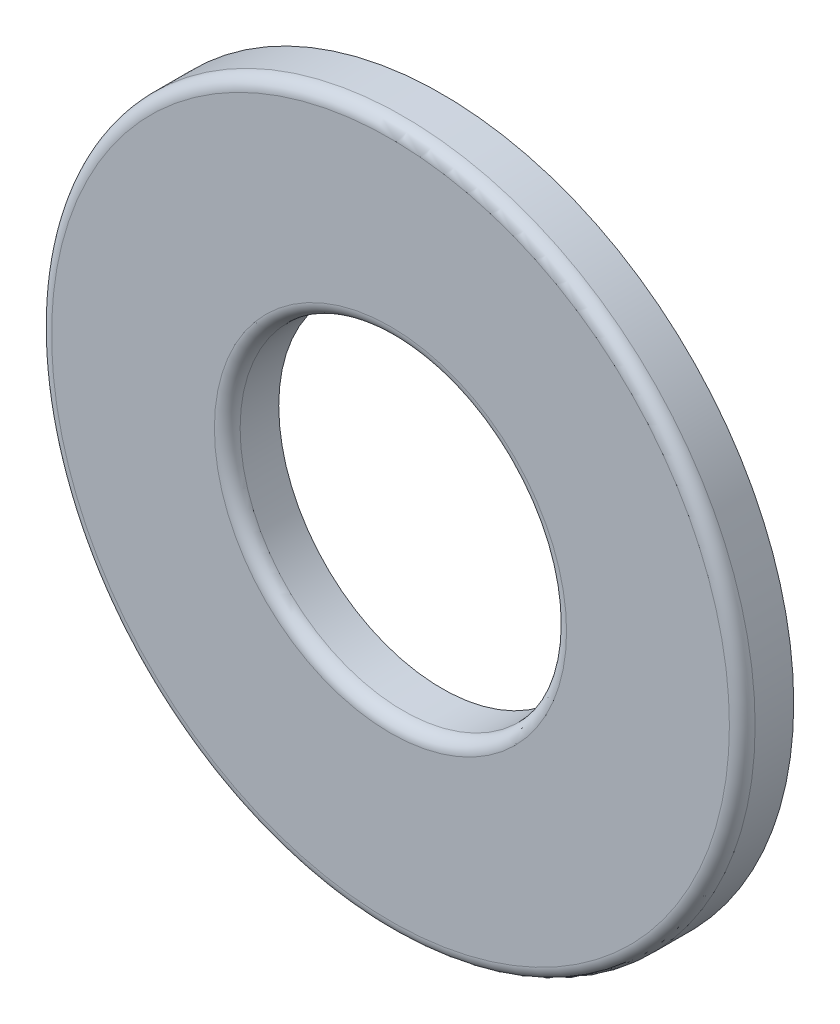
ISO-10303-21;
HEADER;
FILE_DESCRIPTION(('STEP AP214'),'2;1');
FILE_NAME('part.step','',(''),(''),'','','');
FILE_SCHEMA(('AUTOMOTIVE_DESIGN { 1 0 10303 214 1 1 1 1 }'));
ENDSEC;
DATA;
#1=APPLICATION_CONTEXT('core data for automotive mechanical design processes');
#2=APPLICATION_PROTOCOL_DEFINITION('international standard','automotive_design',2000,#1);
#3=PRODUCT_CONTEXT('',#1,'mechanical');
#4=PRODUCT('Part','Part','',(#3));
#5=PRODUCT_RELATED_PRODUCT_CATEGORY('part','',(#4));
#6=PRODUCT_DEFINITION_FORMATION('','',#4);
#7=PRODUCT_DEFINITION_CONTEXT('part definition',#1,'design');
#8=PRODUCT_DEFINITION('design','',#6,#7);
#9=PRODUCT_DEFINITION_SHAPE('','',#8);
#10=(LENGTH_UNIT() NAMED_UNIT(*) SI_UNIT(.MILLI.,.METRE.));
#11=(NAMED_UNIT(*) PLANE_ANGLE_UNIT() SI_UNIT($,.RADIAN.));
#12=(NAMED_UNIT(*) SI_UNIT($,.STERADIAN.) SOLID_ANGLE_UNIT());
#13=UNCERTAINTY_MEASURE_WITH_UNIT(LENGTH_MEASURE(1.E-05),#10,'distance_accuracy_value','');
#14=(GEOMETRIC_REPRESENTATION_CONTEXT(3) GLOBAL_UNCERTAINTY_ASSIGNED_CONTEXT((#13)) GLOBAL_UNIT_ASSIGNED_CONTEXT((#10,
#11,#12)) REPRESENTATION_CONTEXT('',''));
#15=CARTESIAN_POINT('',(0.,0.,0.));
#16=DIRECTION('',(0.,0.,1.));
#17=DIRECTION('',(1.,0.,0.));
#18=AXIS2_PLACEMENT_3D('',#15,#16,#17);
#19=CARTESIAN_POINT('',(0.,0.,0.406399999999997));
#20=DIRECTION('',(0.,0.,1.));
#21=DIRECTION('',(1.,0.,0.));
#22=AXIS2_PLACEMENT_3D('',#19,#20,#21);
#23=PLANE('',#22);
#24=CARTESIAN_POINT('',(0.,0.,0.406399999999997));
#25=DIRECTION('',(0.,0.,1.));
#26=DIRECTION('',(1.,0.,0.));
#27=AXIS2_PLACEMENT_3D('',#24,#25,#26);
#28=CIRCLE('',#27,5.35305);
#29=CARTESIAN_POINT('',(5.35305,0.,0.406399999999997));
#30=VERTEX_POINT('',#29);
#31=EDGE_CURVE('E57',#30,#30,#28,.T.);
#32=ORIENTED_EDGE('',*,*,#31,.T.);
#33=EDGE_LOOP('',(#32));
#34=FACE_BOUND('',#33,.T.);
#35=CARTESIAN_POINT('',(0.,0.,0.406399999999997));
#36=DIRECTION('',(0.,0.,1.));
#37=DIRECTION('',(1.,0.,0.));
#38=AXIS2_PLACEMENT_3D('',#35,#36,#37);
#39=CIRCLE('',#38,2.7813);
#40=CARTESIAN_POINT('',(2.7813,0.,0.406399999999997));
#41=VERTEX_POINT('',#40);
#42=EDGE_CURVE('E63',#41,#41,#39,.F.);
#43=ORIENTED_EDGE('',*,*,#42,.T.);
#44=EDGE_LOOP('',(#43));
#45=FACE_BOUND('',#44,.T.);
#46=ADVANCED_FACE('F43',(#34,#45),#23,.T.);
#47=CARTESIAN_POINT('',(0.,0.,0.406399999999997));
#48=DIRECTION('',(0.,0.,-1.));
#49=DIRECTION('',(-1.,0.,0.));
#50=AXIS2_PLACEMENT_3D('',#47,#48,#49);
#51=CYLINDRICAL_SURFACE('',#50,5.55625);
#52=CARTESIAN_POINT('',(0.,0.,0.203199999999997));
#53=DIRECTION('',(0.,0.,1.));
#54=DIRECTION('',(1.,0.,0.));
#55=AXIS2_PLACEMENT_3D('',#52,#53,#54);
#56=CIRCLE('',#55,5.55625);
#57=CARTESIAN_POINT('',(5.55625,0.,0.203199999999997));
#58=VERTEX_POINT('',#57);
#59=EDGE_CURVE('E51',#58,#58,#56,.F.);
#60=ORIENTED_EDGE('',*,*,#59,.T.);
#61=EDGE_LOOP('',(#60));
#62=FACE_BOUND('',#61,.T.);
#63=CARTESIAN_POINT('',(0.,0.,-0.406400000000003));
#64=DIRECTION('',(0.,0.,1.));
#65=DIRECTION('',(1.,0.,0.));
#66=AXIS2_PLACEMENT_3D('',#63,#64,#65);
#67=CIRCLE('',#66,5.55625);
#68=CARTESIAN_POINT('',(5.55625,0.,-0.406400000000003));
#69=VERTEX_POINT('',#68);
#70=EDGE_CURVE('E69',#69,#69,#67,.T.);
#71=ORIENTED_EDGE('',*,*,#70,.T.);
#72=EDGE_LOOP('',(#71));
#73=FACE_BOUND('',#72,.T.);
#74=ADVANCED_FACE('F84',(#62,#73),#51,.T.);
#75=CARTESIAN_POINT('',(0.,0.,0.406399999999997));
#76=DIRECTION('',(0.,0.,-1.));
#77=DIRECTION('',(-1.,0.,0.));
#78=AXIS2_PLACEMENT_3D('',#75,#76,#77);
#79=CYLINDRICAL_SURFACE('',#78,2.5781);
#80=CARTESIAN_POINT('',(0.,0.,0.203199999999997));
#81=DIRECTION('',(0.,0.,1.));
#82=DIRECTION('',(1.,0.,0.));
#83=AXIS2_PLACEMENT_3D('',#80,#81,#82);
#84=CIRCLE('',#83,2.5781);
#85=CARTESIAN_POINT('',(2.5781,0.,0.203199999999997));
#86=VERTEX_POINT('',#85);
#87=EDGE_CURVE('E10',#86,#86,#84,.T.);
#88=ORIENTED_EDGE('',*,*,#87,.T.);
#89=EDGE_LOOP('',(#88));
#90=FACE_BOUND('',#89,.T.);
#91=CARTESIAN_POINT('',(0.,0.,-0.406400000000003));
#92=DIRECTION('',(0.,0.,1.));
#93=DIRECTION('',(1.,0.,0.));
#94=AXIS2_PLACEMENT_3D('',#91,#92,#93);
#95=CIRCLE('',#94,2.5781);
#96=CARTESIAN_POINT('',(2.5781,0.,-0.406400000000003));
#97=VERTEX_POINT('',#96);
#98=EDGE_CURVE('E73',#97,#97,#95,.T.);
#99=ORIENTED_EDGE('',*,*,#98,.F.);
#100=EDGE_LOOP('',(#99));
#101=FACE_BOUND('',#100,.T.);
#102=ADVANCED_FACE('F82',(#90,#101),#79,.F.);
#103=CARTESIAN_POINT('',(0.,0.,-0.406400000000003));
#104=DIRECTION('',(0.,0.,1.));
#105=DIRECTION('',(1.,0.,0.));
#106=AXIS2_PLACEMENT_3D('',#103,#104,#105);
#107=PLANE('',#106);
#108=ORIENTED_EDGE('',*,*,#98,.T.);
#109=EDGE_LOOP('',(#108));
#110=FACE_BOUND('',#109,.T.);
#111=ORIENTED_EDGE('',*,*,#70,.F.);
#112=EDGE_LOOP('',(#111));
#113=FACE_BOUND('',#112,.T.);
#114=ADVANCED_FACE('F79',(#110,#113),#107,.F.);
#115=CARTESIAN_POINT('',(0.,0.,0.203199999999997));
#116=DIRECTION('',(0.,0.,1.));
#117=DIRECTION('',(1.,0.,0.));
#118=AXIS2_PLACEMENT_3D('',#115,#116,#117);
#119=TOROIDAL_SURFACE('',#118,5.35305,0.2032);
#120=ORIENTED_EDGE('',*,*,#59,.F.);
#121=EDGE_LOOP('',(#120));
#122=FACE_BOUND('',#121,.T.);
#123=ORIENTED_EDGE('',*,*,#31,.F.);
#124=EDGE_LOOP('',(#123));
#125=FACE_BOUND('',#124,.T.);
#126=ADVANCED_FACE('F91',(#122,#125),#119,.T.);
#127=CARTESIAN_POINT('',(0.,0.,0.203199999999997));
#128=DIRECTION('',(0.,0.,1.));
#129=DIRECTION('',(1.,0.,0.));
#130=AXIS2_PLACEMENT_3D('',#127,#128,#129);
#131=TOROIDAL_SURFACE('',#130,2.7813,0.2032);
#132=ORIENTED_EDGE('',*,*,#42,.F.);
#133=EDGE_LOOP('',(#132));
#134=FACE_BOUND('',#133,.T.);
#135=ORIENTED_EDGE('',*,*,#87,.F.);
#136=EDGE_LOOP('',(#135));
#137=FACE_BOUND('',#136,.T.);
#138=ADVANCED_FACE('F45',(#134,#137),#131,.T.);
#139=CLOSED_SHELL('',(#46,#74,#102,#114,#126,#138));
#140=MANIFOLD_SOLID_BREP('B2',#139);
#141=ADVANCED_BREP_SHAPE_REPRESENTATION('',(#18,#140),#14);
#142=SHAPE_DEFINITION_REPRESENTATION(#9,#141);
ENDSEC;
END-ISO-10303-21;
